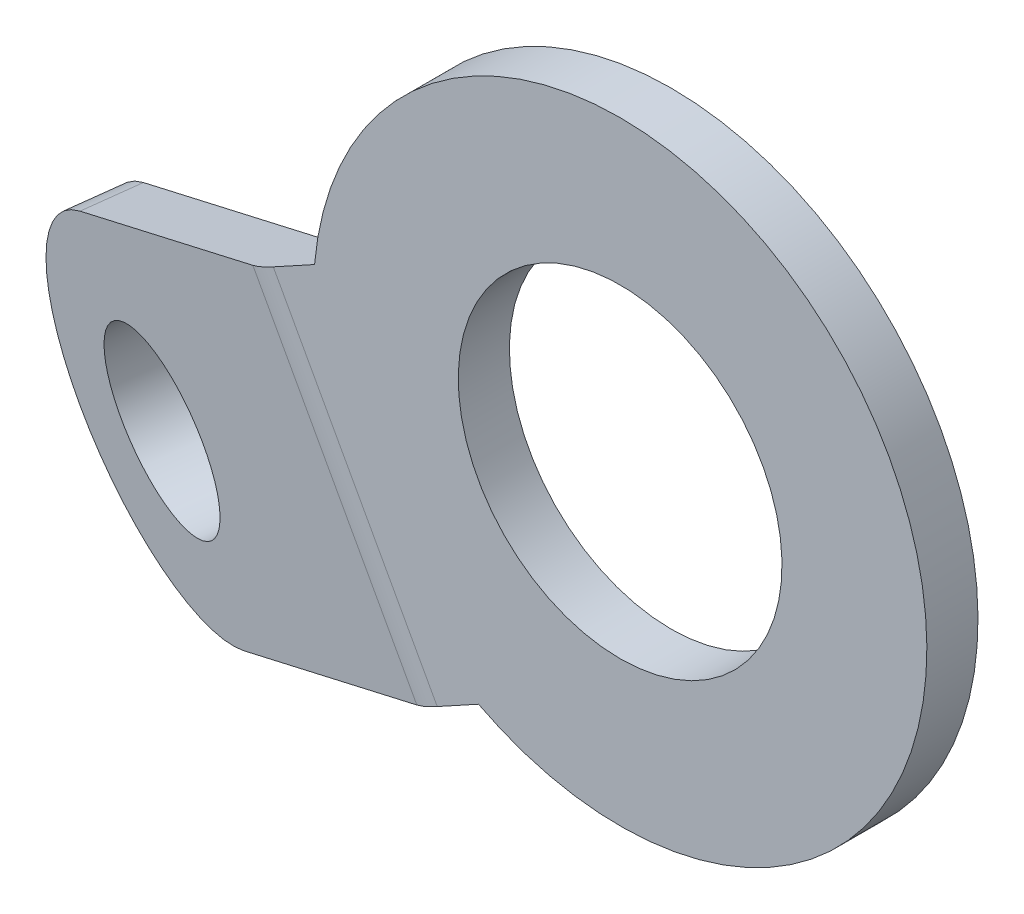
ISO-10303-21;
HEADER;
FILE_DESCRIPTION(('STEP AP214'),'2;1');
FILE_NAME('part.step','',(''),(''),'','','');
FILE_SCHEMA(('AUTOMOTIVE_DESIGN { 1 0 10303 214 1 1 1 1 }'));
ENDSEC;
DATA;
#1=APPLICATION_CONTEXT('core data for automotive mechanical design processes');
#2=APPLICATION_PROTOCOL_DEFINITION('international standard','automotive_design',2000,#1);
#3=PRODUCT_CONTEXT('',#1,'mechanical');
#4=PRODUCT('Part','Part','',(#3));
#5=PRODUCT_RELATED_PRODUCT_CATEGORY('part','',(#4));
#6=PRODUCT_DEFINITION_FORMATION('','',#4);
#7=PRODUCT_DEFINITION_CONTEXT('part definition',#1,'design');
#8=PRODUCT_DEFINITION('design','',#6,#7);
#9=PRODUCT_DEFINITION_SHAPE('','',#8);
#10=(LENGTH_UNIT() NAMED_UNIT(*) SI_UNIT(.MILLI.,.METRE.));
#11=(NAMED_UNIT(*) PLANE_ANGLE_UNIT() SI_UNIT($,.RADIAN.));
#12=(NAMED_UNIT(*) SI_UNIT($,.STERADIAN.) SOLID_ANGLE_UNIT());
#13=UNCERTAINTY_MEASURE_WITH_UNIT(LENGTH_MEASURE(1.E-05),#10,'distance_accuracy_value','');
#14=(GEOMETRIC_REPRESENTATION_CONTEXT(3) GLOBAL_UNCERTAINTY_ASSIGNED_CONTEXT((#13)) GLOBAL_UNIT_ASSIGNED_CONTEXT((#10,
#11,#12)) REPRESENTATION_CONTEXT('',''));
#15=CARTESIAN_POINT('',(0.,0.,0.));
#16=DIRECTION('',(0.,0.,1.));
#17=DIRECTION('',(1.,0.,0.));
#18=AXIS2_PLACEMENT_3D('',#15,#16,#17);
#19=CARTESIAN_POINT('',(-15.1617932381992,21.712794269846,-3.30589808725705));
#20=DIRECTION('',(0.299844837171132,0.164532221957671,-0.939692620785908));
#21=DIRECTION('',(-0.952675966265379,0.,-0.303987669651792));
#22=AXIS2_PLACEMENT_3D('',#19,#20,#21);
#23=PLANE('',#22);
#24=CARTESIAN_POINT('',(-19.3467831890952,19.4163875616709,-5.04336041535146));
#25=DIRECTION('',(-0.299844837171132,-0.164532221957672,0.939692620785908));
#26=DIRECTION('',(0.952675966265379,0.,0.303987669651792));
#27=AXIS2_PLACEMENT_3D('',#24,#25,#26);
#28=CIRCLE('',#27,1.27);
#29=CARTESIAN_POINT('',(-19.9577294329464,20.5297808826155,-5.04336041535146));
#30=VERTEX_POINT('',#29);
#31=CARTESIAN_POINT('',(-18.7358369452441,18.3029942407262,-5.04336041535146));
#32=VERTEX_POINT('',#31);
#33=EDGE_CURVE('E98',#30,#32,#28,.T.);
#34=ORIENTED_EDGE('',*,*,#33,.F.);
#35=DIRECTION('',(0.823816919290954,0.452048564504395,0.34202014387968));
#36=VECTOR('',#35,1.);
#37=CARTESIAN_POINT('',(-19.9577294329464,20.5297808826155,-5.04336041535146));
#38=LINE('',#37,#36);
#39=CARTESIAN_POINT('',(-17.7554261932357,21.7382387265883,-4.12904067600838));
#40=VERTEX_POINT('',#39);
#41=EDGE_CURVE('E93',#30,#40,#38,.T.);
#42=ORIENTED_EDGE('',*,*,#41,.T.);
#43=DIRECTION('',(-0.481060034528451,0.876687654287139,0.));
#44=VECTOR('',#43,1.);
#45=CARTESIAN_POINT('',(-15.9066651275066,18.3690417747569,-4.12904067598278));
#46=LINE('',#45,#44);
#47=CARTESIAN_POINT('',(-16.5335337052355,19.5114520848624,-4.12904067672328));
#48=VERTEX_POINT('',#47);
#49=EDGE_CURVE('E75',#40,#48,#46,.F.);
#50=ORIENTED_EDGE('',*,*,#49,.T.);
#51=DIRECTION('',(-0.823816919467731,-0.452048564601397,-0.342020143325673));
#52=VECTOR('',#51,1.);
#53=CARTESIAN_POINT('',(-16.5335337049992,19.5114520849921,-4.12904067746379));
#54=LINE('',#53,#52);
#55=EDGE_CURVE('E83',#48,#32,#54,.T.);
#56=ORIENTED_EDGE('',*,*,#55,.T.);
#57=EDGE_LOOP('',(#34,#42,#50,#56));
#58=FACE_BOUND('',#57,.T.);
#59=CARTESIAN_POINT('',(-19.3467831890952,19.4163875616709,-5.04336041535147));
#60=DIRECTION('',(-0.299844837171133,-0.164532221957672,0.939692620785908));
#61=DIRECTION('',(0.952675966265378,0.,0.303987669651792));
#62=AXIS2_PLACEMENT_3D('',#59,#60,#61);
#63=CIRCLE('',#62,0.635);
#64=CARTESIAN_POINT('',(-18.7418339505167,19.4163875616709,-4.85032824512258));
#65=VERTEX_POINT('',#64);
#66=EDGE_CURVE('E95',#65,#65,#63,.T.);
#67=ORIENTED_EDGE('',*,*,#66,.T.);
#68=EDGE_LOOP('',(#67));
#69=FACE_BOUND('',#68,.T.);
#70=ADVANCED_FACE('F17',(#58,#69),#23,.T.);
#71=CARTESIAN_POINT('',(-15.8305045383925,18.4108329593935,-4.36772260314341));
#72=DIRECTION('',(-0.481060034528451,0.876687654287139,0.));
#73=DIRECTION('',(-0.876687654287139,-0.481060034528451,0.));
#74=AXIS2_PLACEMENT_3D('',#71,#72,#73);
#75=CYLINDRICAL_SURFACE('',#74,0.254000001576068);
#76=CARTESIAN_POINT('',(-17.67926560406,21.7800299112587,-4.36772260314341));
#77=DIRECTION('',(-0.481060034528451,0.876687654287139,0.));
#78=DIRECTION('',(-0.876687654287139,-0.481060034528451,0.));
#79=AXIS2_PLACEMENT_3D('',#76,#77,#78);
#80=CIRCLE('',#79,0.254000001576068);
#81=CARTESIAN_POINT('',(-17.67926560406,21.7800299112587,-4.11372260235538));
#82=VERTEX_POINT('',#81);
#83=EDGE_CURVE('E80',#82,#40,#80,.F.);
#84=ORIENTED_EDGE('',*,*,#83,.F.);
#85=DIRECTION('',(-0.481060034528442,0.876687654287143,0.));
#86=VECTOR('',#85,1.);
#87=CARTESIAN_POINT('',(-16.4573731163578,19.5532432693693,-4.11372260314341));
#88=LINE('',#87,#86);
#89=CARTESIAN_POINT('',(-16.4573731163577,19.5532432693693,-4.11372260235538));
#90=VERTEX_POINT('',#89);
#91=EDGE_CURVE('E78',#90,#82,#88,.T.);
#92=ORIENTED_EDGE('',*,*,#91,.F.);
#93=CARTESIAN_POINT('',(-16.4573731163577,19.5532432693694,-4.36772260314341));
#94=DIRECTION('',(-0.481060034528451,0.876687654287139,0.));
#95=DIRECTION('',(-0.876687654287139,-0.481060034528451,0.));
#96=AXIS2_PLACEMENT_3D('',#93,#94,#95);
#97=CIRCLE('',#96,0.254000001576068);
#98=EDGE_CURVE('E20',#48,#90,#97,.T.);
#99=ORIENTED_EDGE('',*,*,#98,.F.);
#100=ORIENTED_EDGE('',*,*,#49,.F.);
#101=EDGE_LOOP('',(#84,#92,#99,#100));
#102=FACE_BOUND('',#101,.T.);
#103=ADVANCED_FACE('F73',(#102),#75,.F.);
#104=CARTESIAN_POINT('',(-19.3467831890952,19.4163875616709,-5.04336041535146));
#105=DIRECTION('',(-0.299844837171133,-0.164532221957672,0.939692620785908));
#106=DIRECTION('',(0.952675966265378,0.,0.303987669651792));
#107=AXIS2_PLACEMENT_3D('',#104,#105,#106);
#108=CYLINDRICAL_SURFACE('',#107,0.635);
#109=CARTESIAN_POINT('',(-19.4610240720575,19.353700785105,-4.68533752683203));
#110=DIRECTION('',(-0.299844837171133,-0.164532221957672,0.939692620785908));
#111=DIRECTION('',(0.952675966265378,0.,0.303987669651792));
#112=AXIS2_PLACEMENT_3D('',#109,#110,#111);
#113=CIRCLE('',#112,0.635);
#114=CARTESIAN_POINT('',(-18.8560748334789,19.353700785105,-4.49230535660314));
#115=VERTEX_POINT('',#114);
#116=EDGE_CURVE('E126',#115,#115,#113,.T.);
#117=ORIENTED_EDGE('',*,*,#116,.T.);
#118=EDGE_LOOP('',(#117));
#119=FACE_BOUND('',#118,.T.);
#120=ORIENTED_EDGE('',*,*,#66,.F.);
#121=EDGE_LOOP('',(#120));
#122=FACE_BOUND('',#121,.T.);
#123=ADVANCED_FACE('F174',(#119,#122),#108,.F.);
#124=CARTESIAN_POINT('',(-19.3467831890952,19.4163875616709,-5.04336041535146));
#125=DIRECTION('',(-0.299844837171132,-0.164532221957672,0.939692620785908));
#126=DIRECTION('',(0.952675966265379,0.,0.303987669651792));
#127=AXIS2_PLACEMENT_3D('',#124,#125,#126);
#128=CYLINDRICAL_SURFACE('',#127,1.27);
#129=ORIENTED_EDGE('',*,*,#33,.T.);
#130=DIRECTION('',(-0.299844837171206,-0.164532221957705,0.939692620785879));
#131=VECTOR('',#130,1.);
#132=CARTESIAN_POINT('',(-18.7358369452441,18.3029942407262,-5.04336041535146));
#133=LINE('',#132,#131);
#134=CARTESIAN_POINT('',(-18.8500778282064,18.2403074641603,-4.68533752683203));
#135=VERTEX_POINT('',#134);
#136=EDGE_CURVE('E87',#32,#135,#133,.T.);
#137=ORIENTED_EDGE('',*,*,#136,.T.);
#138=CARTESIAN_POINT('',(-19.4610240720575,19.353700785105,-4.68533752683203));
#139=DIRECTION('',(-0.299844837171132,-0.164532221957672,0.939692620785908));
#140=DIRECTION('',(0.952675966265379,0.,0.303987669651792));
#141=AXIS2_PLACEMENT_3D('',#138,#139,#140);
#142=CIRCLE('',#141,1.27);
#143=CARTESIAN_POINT('',(-20.0719703159086,20.4670941060497,-4.68533752683202));
#144=VERTEX_POINT('',#143);
#145=EDGE_CURVE('E122',#135,#144,#142,.F.);
#146=ORIENTED_EDGE('',*,*,#145,.T.);
#147=DIRECTION('',(0.299844837171118,0.164532221957657,-0.939692620785915));
#148=VECTOR('',#147,1.);
#149=CARTESIAN_POINT('',(-20.0719703159086,20.4670941060497,-4.68533752683203));
#150=LINE('',#149,#148);
#151=EDGE_CURVE('E129',#144,#30,#150,.T.);
#152=ORIENTED_EDGE('',*,*,#151,.T.);
#153=EDGE_LOOP('',(#129,#137,#146,#152));
#154=FACE_BOUND('',#153,.T.);
#155=ADVANCED_FACE('F171',(#154),#128,.T.);
#156=CARTESIAN_POINT('',(-15.094414888192,21.7497664243214,-4.11372260314341));
#157=DIRECTION('',(0.,0.,-1.));
#158=DIRECTION('',(0.,1.,0.));
#159=AXIS2_PLACEMENT_3D('',#156,#157,#158);
#160=PLANE('',#159);
#161=DIRECTION('',(0.876687654287139,0.48106003452845,0.));
#162=VECTOR('',#161,1.);
#163=CARTESIAN_POINT('',(-17.371735669522,21.9487791347751,-4.11372260156734));
#164=LINE('',#163,#162);
#165=CARTESIAN_POINT('',(-17.371735669522,21.9487791347751,-4.11372260235538));
#166=VERTEX_POINT('',#165);
#167=EDGE_CURVE('E120',#82,#166,#164,.T.);
#168=ORIENTED_EDGE('',*,*,#167,.T.);
#169=CARTESIAN_POINT('',(-15.094414888192,21.7497664243214,-4.11372260314341));
#170=DIRECTION('',(0.,0.,1.));
#171=DIRECTION('',(0.,-1.,0.));
#172=AXIS2_PLACEMENT_3D('',#169,#170,#171);
#173=CIRCLE('',#172,2.286);
#174=CARTESIAN_POINT('',(-16.1498431818198,19.7219924928857,-4.11372260314341));
#175=VERTEX_POINT('',#174);
#176=EDGE_CURVE('E113',#175,#166,#173,.T.);
#177=ORIENTED_EDGE('',*,*,#176,.F.);
#178=DIRECTION('',(-0.876687654287154,-0.481060034528422,0.));
#179=VECTOR('',#178,1.);
#180=CARTESIAN_POINT('',(-16.1498431818198,19.7219924928858,-4.11372260314341));
#181=LINE('',#180,#179);
#182=EDGE_CURVE('E89',#175,#90,#181,.T.);
#183=ORIENTED_EDGE('',*,*,#182,.T.);
#184=ORIENTED_EDGE('',*,*,#91,.T.);
#185=EDGE_LOOP('',(#168,#177,#183,#184));
#186=FACE_BOUND('',#185,.T.);
#187=CARTESIAN_POINT('',(-15.094414888192,21.7497664243214,-4.11372260314341));
#188=DIRECTION('',(0.,0.,1.));
#189=DIRECTION('',(0.,-1.,0.));
#190=AXIS2_PLACEMENT_3D('',#187,#188,#189);
#191=CIRCLE('',#190,1.2065);
#192=CARTESIAN_POINT('',(-15.094414888192,20.5432664243214,-4.11372260314341));
#193=VERTEX_POINT('',#192);
#194=EDGE_CURVE('E117',#193,#193,#191,.T.);
#195=ORIENTED_EDGE('',*,*,#194,.T.);
#196=EDGE_LOOP('',(#195));
#197=FACE_BOUND('',#196,.T.);
#198=ADVANCED_FACE('F173',(#186,#197),#160,.T.);
#199=CARTESIAN_POINT('',(-15.2760341211614,21.6501074932801,-2.94787519873763));
#200=DIRECTION('',(0.299844837171132,0.164532221957671,-0.939692620785908));
#201=DIRECTION('',(-0.952675966265379,0.,-0.303987669651792));
#202=AXIS2_PLACEMENT_3D('',#199,#200,#201);
#203=PLANE('',#202);
#204=DIRECTION('',(-0.48106003452845,0.876687654287139,0.));
#205=VECTOR('',#204,1.);
#206=CARTESIAN_POINT('',(-16.0209060104688,18.3063549981911,-3.77101778746334));
#207=LINE('',#206,#205);
#208=CARTESIAN_POINT('',(-17.8696670758999,21.6755519501859,-3.77101778820385));
#209=VERTEX_POINT('',#208);
#210=CARTESIAN_POINT('',(-16.6477745881977,19.4487653082966,-3.77101778820384));
#211=VERTEX_POINT('',#210);
#212=EDGE_CURVE('E112',#209,#211,#207,.F.);
#213=ORIENTED_EDGE('',*,*,#212,.F.);
#214=DIRECTION('',(0.823816919467737,0.45204856460139,0.342020143325669));
#215=VECTOR('',#214,1.);
#216=CARTESIAN_POINT('',(-20.0719703159086,20.4670941060497,-4.68533752683201));
#217=LINE('',#216,#215);
#218=EDGE_CURVE('E125',#144,#209,#217,.T.);
#219=ORIENTED_EDGE('',*,*,#218,.F.);
#220=ORIENTED_EDGE('',*,*,#145,.F.);
#221=DIRECTION('',(-0.823816919467738,-0.452048564601388,-0.342020143325669));
#222=VECTOR('',#221,1.);
#223=CARTESIAN_POINT('',(-16.6477745879614,19.4487653084262,-3.77101778894436));
#224=LINE('',#223,#222);
#225=EDGE_CURVE('E121',#211,#135,#224,.T.);
#226=ORIENTED_EDGE('',*,*,#225,.F.);
#227=EDGE_LOOP('',(#213,#219,#220,#226));
#228=FACE_BOUND('',#227,.T.);
#229=ORIENTED_EDGE('',*,*,#116,.F.);
#230=EDGE_LOOP('',(#229));
#231=FACE_BOUND('',#230,.T.);
#232=ADVANCED_FACE('F169',(#228,#231),#203,.F.);
#233=CARTESIAN_POINT('',(-15.094414888192,21.7497664243214,-4.11372260314341));
#234=DIRECTION('',(0.,0.,1.));
#235=DIRECTION('',(0.,-1.,0.));
#236=AXIS2_PLACEMENT_3D('',#233,#234,#235);
#237=CYLINDRICAL_SURFACE('',#236,1.2065);
#238=CARTESIAN_POINT('',(-15.094414888192,21.7497664243214,-3.73272260314341));
#239=DIRECTION('',(0.,0.,1.));
#240=DIRECTION('',(0.,-1.,0.));
#241=AXIS2_PLACEMENT_3D('',#238,#239,#240);
#242=CIRCLE('',#241,1.2065);
#243=CARTESIAN_POINT('',(-15.094414888192,20.5432664243214,-3.73272260314341));
#244=VERTEX_POINT('',#243);
#245=EDGE_CURVE('E105',#244,#244,#242,.T.);
#246=ORIENTED_EDGE('',*,*,#245,.T.);
#247=EDGE_LOOP('',(#246));
#248=FACE_BOUND('',#247,.T.);
#249=ORIENTED_EDGE('',*,*,#194,.F.);
#250=EDGE_LOOP('',(#249));
#251=FACE_BOUND('',#250,.T.);
#252=ADVANCED_FACE('F200',(#248,#251),#237,.F.);
#253=CARTESIAN_POINT('',(-17.371735669522,21.9487791347751,-4.11372260314341));
#254=DIRECTION('',(0.48106003452845,-0.876687654287139,0.));
#255=DIRECTION('',(0.876687654287139,0.48106003452845,0.));
#256=AXIS2_PLACEMENT_3D('',#253,#254,#255);
#257=PLANE('',#256);
#258=DIRECTION('',(0.876687654287163,0.481060034528407,0.));
#259=VECTOR('',#258,1.);
#260=CARTESIAN_POINT('',(-17.67926560406,21.7800299112587,-3.73272260314341));
#261=LINE('',#260,#259);
#262=CARTESIAN_POINT('',(-17.67926560406,21.7800299112587,-3.73272260235538));
#263=VERTEX_POINT('',#262);
#264=CARTESIAN_POINT('',(-17.371735669522,21.9487791347751,-3.73272260314341));
#265=VERTEX_POINT('',#264);
#266=EDGE_CURVE('E104',#263,#265,#261,.T.);
#267=ORIENTED_EDGE('',*,*,#266,.T.);
#268=DIRECTION('',(0.,0.,1.));
#269=VECTOR('',#268,1.);
#270=CARTESIAN_POINT('',(-17.371735669522,21.9487791347751,-4.11372260314341));
#271=LINE('',#270,#269);
#272=EDGE_CURVE('E116',#166,#265,#271,.T.);
#273=ORIENTED_EDGE('',*,*,#272,.F.);
#274=ORIENTED_EDGE('',*,*,#167,.F.);
#275=ORIENTED_EDGE('',*,*,#83,.T.);
#276=ORIENTED_EDGE('',*,*,#41,.F.);
#277=ORIENTED_EDGE('',*,*,#151,.F.);
#278=ORIENTED_EDGE('',*,*,#218,.T.);
#279=CARTESIAN_POINT('',(-17.67926560406,21.7800299112587,-4.36772260314341));
#280=DIRECTION('',(-0.48106003452845,0.876687654287139,0.));
#281=DIRECTION('',(-0.876687654287139,-0.48106003452845,0.));
#282=AXIS2_PLACEMENT_3D('',#279,#280,#281);
#283=CIRCLE('',#282,0.635000001576068);
#284=EDGE_CURVE('E108',#263,#209,#283,.F.);
#285=ORIENTED_EDGE('',*,*,#284,.F.);
#286=EDGE_LOOP('',(#267,#273,#274,#275,#276,#277,#278,#285));
#287=FACE_BOUND('',#286,.T.);
#288=ADVANCED_FACE('F167',(#287),#257,.F.);
#289=CARTESIAN_POINT('',(-15.094414888192,21.7497664243214,-4.11372260314341));
#290=DIRECTION('',(0.,0.,1.));
#291=DIRECTION('',(0.,-1.,0.));
#292=AXIS2_PLACEMENT_3D('',#289,#290,#291);
#293=CYLINDRICAL_SURFACE('',#292,2.286);
#294=CARTESIAN_POINT('',(-15.094414888192,21.7497664243214,-3.73272260314341));
#295=DIRECTION('',(0.,0.,1.));
#296=DIRECTION('',(0.,-1.,0.));
#297=AXIS2_PLACEMENT_3D('',#294,#295,#296);
#298=CIRCLE('',#297,2.286);
#299=CARTESIAN_POINT('',(-16.1498431818198,19.7219924928857,-3.73272260314341));
#300=VERTEX_POINT('',#299);
#301=EDGE_CURVE('E102',#265,#300,#298,.F.);
#302=ORIENTED_EDGE('',*,*,#301,.T.);
#303=DIRECTION('',(0.,0.,1.));
#304=VECTOR('',#303,1.);
#305=CARTESIAN_POINT('',(-16.1498431818198,19.7219924928858,-4.11372260314341));
#306=LINE('',#305,#304);
#307=EDGE_CURVE('E115',#300,#175,#306,.F.);
#308=ORIENTED_EDGE('',*,*,#307,.T.);
#309=ORIENTED_EDGE('',*,*,#176,.T.);
#310=ORIENTED_EDGE('',*,*,#272,.T.);
#311=EDGE_LOOP('',(#302,#308,#309,#310));
#312=FACE_BOUND('',#311,.T.);
#313=ADVANCED_FACE('F194',(#312),#293,.T.);
#314=CARTESIAN_POINT('',(-16.1498431818198,19.7219924928858,-4.11372260314341));
#315=DIRECTION('',(-0.48106003452845,0.876687654287139,0.));
#316=DIRECTION('',(-0.876687654287139,-0.48106003452845,0.));
#317=AXIS2_PLACEMENT_3D('',#314,#315,#316);
#318=PLANE('',#317);
#319=ORIENTED_EDGE('',*,*,#182,.F.);
#320=ORIENTED_EDGE('',*,*,#307,.F.);
#321=DIRECTION('',(-0.876687654287154,-0.481060034528422,0.));
#322=VECTOR('',#321,1.);
#323=CARTESIAN_POINT('',(-16.1498431818198,19.7219924928858,-3.73272260314341));
#324=LINE('',#323,#322);
#325=CARTESIAN_POINT('',(-16.4573731163577,19.5532432693693,-3.73272260235538));
#326=VERTEX_POINT('',#325);
#327=EDGE_CURVE('E26',#300,#326,#324,.T.);
#328=ORIENTED_EDGE('',*,*,#327,.T.);
#329=CARTESIAN_POINT('',(-16.4573731163577,19.5532432693693,-4.36772260314341));
#330=DIRECTION('',(-0.48106003452845,0.876687654287139,0.));
#331=DIRECTION('',(-0.876687654287139,-0.48106003452845,0.));
#332=AXIS2_PLACEMENT_3D('',#329,#330,#331);
#333=CIRCLE('',#332,0.635000001576068);
#334=EDGE_CURVE('E34',#211,#326,#333,.T.);
#335=ORIENTED_EDGE('',*,*,#334,.F.);
#336=ORIENTED_EDGE('',*,*,#225,.T.);
#337=ORIENTED_EDGE('',*,*,#136,.F.);
#338=ORIENTED_EDGE('',*,*,#55,.F.);
#339=ORIENTED_EDGE('',*,*,#98,.T.);
#340=EDGE_LOOP('',(#319,#320,#328,#335,#336,#337,#338,#339));
#341=FACE_BOUND('',#340,.T.);
#342=ADVANCED_FACE('F84',(#341),#318,.F.);
#343=CARTESIAN_POINT('',(-15.8305045383925,18.4108329593935,-4.36772260314341));
#344=DIRECTION('',(-0.48106003452845,0.876687654287139,0.));
#345=DIRECTION('',(-0.876687654287139,-0.48106003452845,0.));
#346=AXIS2_PLACEMENT_3D('',#343,#344,#345);
#347=CYLINDRICAL_SURFACE('',#346,0.635000001576068);
#348=DIRECTION('',(-0.481060034528442,0.876687654287143,0.));
#349=VECTOR('',#348,1.);
#350=CARTESIAN_POINT('',(-16.4573731163578,19.5532432693693,-3.73272260314341));
#351=LINE('',#350,#349);
#352=EDGE_CURVE('E11',#326,#263,#351,.T.);
#353=ORIENTED_EDGE('',*,*,#352,.T.);
#354=ORIENTED_EDGE('',*,*,#284,.T.);
#355=ORIENTED_EDGE('',*,*,#212,.T.);
#356=ORIENTED_EDGE('',*,*,#334,.T.);
#357=EDGE_LOOP('',(#353,#354,#355,#356));
#358=FACE_BOUND('',#357,.T.);
#359=ADVANCED_FACE('F160',(#358),#347,.T.);
#360=CARTESIAN_POINT('',(-15.094414888192,21.7497664243214,-3.73272260314341));
#361=DIRECTION('',(0.,0.,-1.));
#362=DIRECTION('',(0.,1.,0.));
#363=AXIS2_PLACEMENT_3D('',#360,#361,#362);
#364=PLANE('',#363);
#365=ORIENTED_EDGE('',*,*,#327,.F.);
#366=ORIENTED_EDGE('',*,*,#301,.F.);
#367=ORIENTED_EDGE('',*,*,#266,.F.);
#368=ORIENTED_EDGE('',*,*,#352,.F.);
#369=EDGE_LOOP('',(#365,#366,#367,#368));
#370=FACE_BOUND('',#369,.T.);
#371=ORIENTED_EDGE('',*,*,#245,.F.);
#372=EDGE_LOOP('',(#371));
#373=FACE_BOUND('',#372,.T.);
#374=ADVANCED_FACE('F155',(#370,#373),#364,.F.);
#375=CLOSED_SHELL('',(#70,#103,#123,#155,#198,#232,#252,#288,#313,#342,#359,#374));
#376=MANIFOLD_SOLID_BREP('B1',#375);
#377=ADVANCED_BREP_SHAPE_REPRESENTATION('',(#18,#376),#14);
#378=SHAPE_DEFINITION_REPRESENTATION(#9,#377);
ENDSEC;
END-ISO-10303-21;
